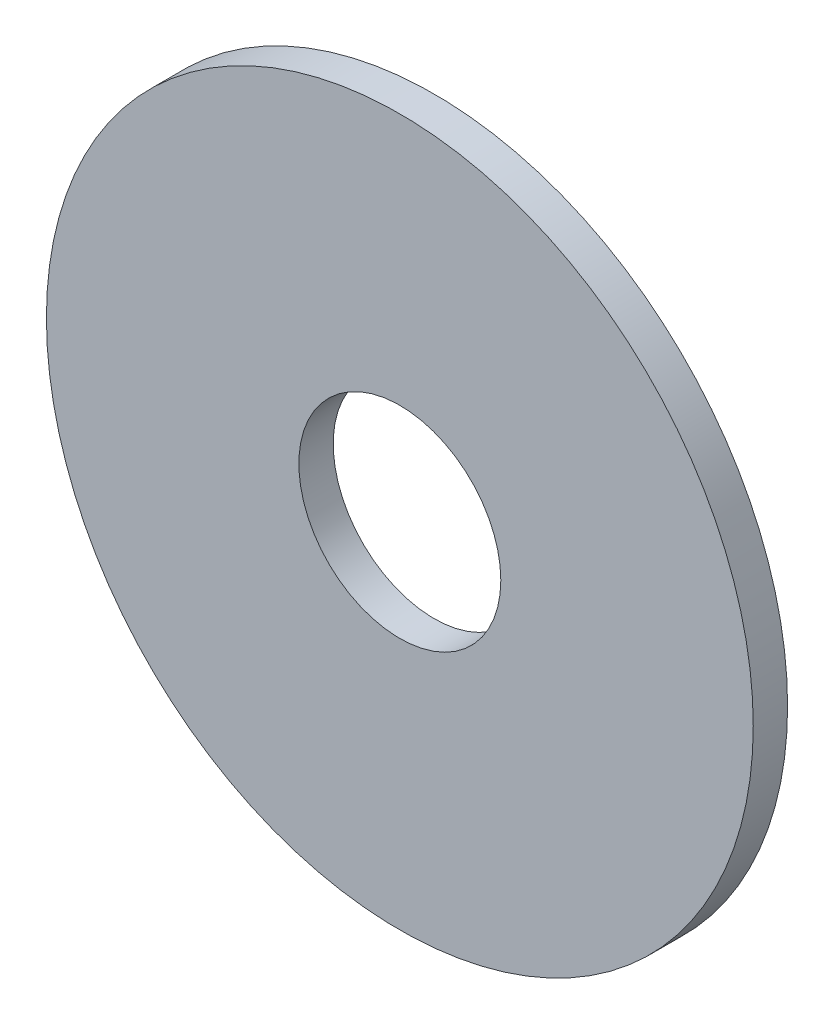
ISO-10303-21;
HEADER;
FILE_DESCRIPTION(('STEP AP214'),'2;1');
FILE_NAME('part.step','',(''),(''),'','','');
FILE_SCHEMA(('AUTOMOTIVE_DESIGN { 1 0 10303 214 1 1 1 1 }'));
ENDSEC;
DATA;
#1=APPLICATION_CONTEXT('core data for automotive mechanical design processes');
#2=APPLICATION_PROTOCOL_DEFINITION('international standard','automotive_design',2000,#1);
#3=PRODUCT_CONTEXT('',#1,'mechanical');
#4=PRODUCT('Part','Part','',(#3));
#5=PRODUCT_RELATED_PRODUCT_CATEGORY('part','',(#4));
#6=PRODUCT_DEFINITION_FORMATION('','',#4);
#7=PRODUCT_DEFINITION_CONTEXT('part definition',#1,'design');
#8=PRODUCT_DEFINITION('design','',#6,#7);
#9=PRODUCT_DEFINITION_SHAPE('','',#8);
#10=(LENGTH_UNIT() NAMED_UNIT(*) SI_UNIT(.MILLI.,.METRE.));
#11=(NAMED_UNIT(*) PLANE_ANGLE_UNIT() SI_UNIT($,.RADIAN.));
#12=(NAMED_UNIT(*) SI_UNIT($,.STERADIAN.) SOLID_ANGLE_UNIT());
#13=UNCERTAINTY_MEASURE_WITH_UNIT(LENGTH_MEASURE(1.E-05),#10,'distance_accuracy_value','');
#14=(GEOMETRIC_REPRESENTATION_CONTEXT(3) GLOBAL_UNCERTAINTY_ASSIGNED_CONTEXT((#13)) GLOBAL_UNIT_ASSIGNED_CONTEXT((#10,
#11,#12)) REPRESENTATION_CONTEXT('',''));
#15=CARTESIAN_POINT('',(0.,0.,0.));
#16=DIRECTION('',(0.,0.,1.));
#17=DIRECTION('',(1.,0.,0.));
#18=AXIS2_PLACEMENT_3D('',#15,#16,#17);
#19=CARTESIAN_POINT('',(0.,0.,1.7));
#20=DIRECTION('',(0.,0.,1.));
#21=DIRECTION('',(1.,0.,0.));
#22=AXIS2_PLACEMENT_3D('',#19,#20,#21);
#23=PLANE('',#22);
#24=CARTESIAN_POINT('',(0.,0.,1.7));
#25=DIRECTION('',(0.,0.,1.));
#26=DIRECTION('',(1.,0.,0.));
#27=AXIS2_PLACEMENT_3D('',#24,#25,#26);
#28=CIRCLE('',#27,17.5);
#29=CARTESIAN_POINT('',(17.5,0.,1.7));
#30=VERTEX_POINT('',#29);
#31=EDGE_CURVE('E10',#30,#30,#28,.T.);
#32=ORIENTED_EDGE('',*,*,#31,.T.);
#33=EDGE_LOOP('',(#32));
#34=FACE_BOUND('',#33,.T.);
#35=CARTESIAN_POINT('',(0.,0.,1.7));
#36=DIRECTION('',(0.,0.,1.));
#37=DIRECTION('',(1.,0.,0.));
#38=AXIS2_PLACEMENT_3D('',#35,#36,#37);
#39=CIRCLE('',#38,5.);
#40=CARTESIAN_POINT('',(5.,0.,1.7));
#41=VERTEX_POINT('',#40);
#42=EDGE_CURVE('E42',#41,#41,#39,.T.);
#43=ORIENTED_EDGE('',*,*,#42,.F.);
#44=EDGE_LOOP('',(#43));
#45=FACE_BOUND('',#44,.T.);
#46=ADVANCED_FACE('F31',(#34,#45),#23,.T.);
#47=CARTESIAN_POINT('',(0.,0.,0.));
#48=DIRECTION('',(0.,0.,1.));
#49=DIRECTION('',(1.,0.,0.));
#50=AXIS2_PLACEMENT_3D('',#47,#48,#49);
#51=PLANE('',#50);
#52=CARTESIAN_POINT('',(0.,0.,0.));
#53=DIRECTION('',(0.,0.,1.));
#54=DIRECTION('',(1.,0.,0.));
#55=AXIS2_PLACEMENT_3D('',#52,#53,#54);
#56=CIRCLE('',#55,17.5);
#57=CARTESIAN_POINT('',(17.5,0.,0.));
#58=VERTEX_POINT('',#57);
#59=EDGE_CURVE('E35',#58,#58,#56,.T.);
#60=ORIENTED_EDGE('',*,*,#59,.F.);
#61=EDGE_LOOP('',(#60));
#62=FACE_BOUND('',#61,.T.);
#63=CARTESIAN_POINT('',(0.,0.,0.));
#64=DIRECTION('',(0.,0.,1.));
#65=DIRECTION('',(1.,0.,0.));
#66=AXIS2_PLACEMENT_3D('',#63,#64,#65);
#67=CIRCLE('',#66,5.);
#68=CARTESIAN_POINT('',(5.,0.,0.));
#69=VERTEX_POINT('',#68);
#70=EDGE_CURVE('E44',#69,#69,#67,.T.);
#71=ORIENTED_EDGE('',*,*,#70,.T.);
#72=EDGE_LOOP('',(#71));
#73=FACE_BOUND('',#72,.T.);
#74=ADVANCED_FACE('F54',(#62,#73),#51,.F.);
#75=CARTESIAN_POINT('',(0.,0.,1.7));
#76=DIRECTION('',(0.,0.,-1.));
#77=DIRECTION('',(-1.,0.,0.));
#78=AXIS2_PLACEMENT_3D('',#75,#76,#77);
#79=CYLINDRICAL_SURFACE('',#78,17.5);
#80=ORIENTED_EDGE('',*,*,#31,.F.);
#81=EDGE_LOOP('',(#80));
#82=FACE_BOUND('',#81,.T.);
#83=ORIENTED_EDGE('',*,*,#59,.T.);
#84=EDGE_LOOP('',(#83));
#85=FACE_BOUND('',#84,.T.);
#86=ADVANCED_FACE('F33',(#82,#85),#79,.T.);
#87=CARTESIAN_POINT('',(0.,0.,1.7));
#88=DIRECTION('',(0.,0.,-1.));
#89=DIRECTION('',(-1.,0.,0.));
#90=AXIS2_PLACEMENT_3D('',#87,#88,#89);
#91=CYLINDRICAL_SURFACE('',#90,5.);
#92=ORIENTED_EDGE('',*,*,#42,.T.);
#93=EDGE_LOOP('',(#92));
#94=FACE_BOUND('',#93,.T.);
#95=ORIENTED_EDGE('',*,*,#70,.F.);
#96=EDGE_LOOP('',(#95));
#97=FACE_BOUND('',#96,.T.);
#98=ADVANCED_FACE('F50',(#94,#97),#91,.F.);
#99=CLOSED_SHELL('',(#46,#74,#86,#98));
#100=MANIFOLD_SOLID_BREP('B2',#99);
#101=ADVANCED_BREP_SHAPE_REPRESENTATION('',(#18,#100),#14);
#102=SHAPE_DEFINITION_REPRESENTATION(#9,#101);
ENDSEC;
END-ISO-10303-21;
